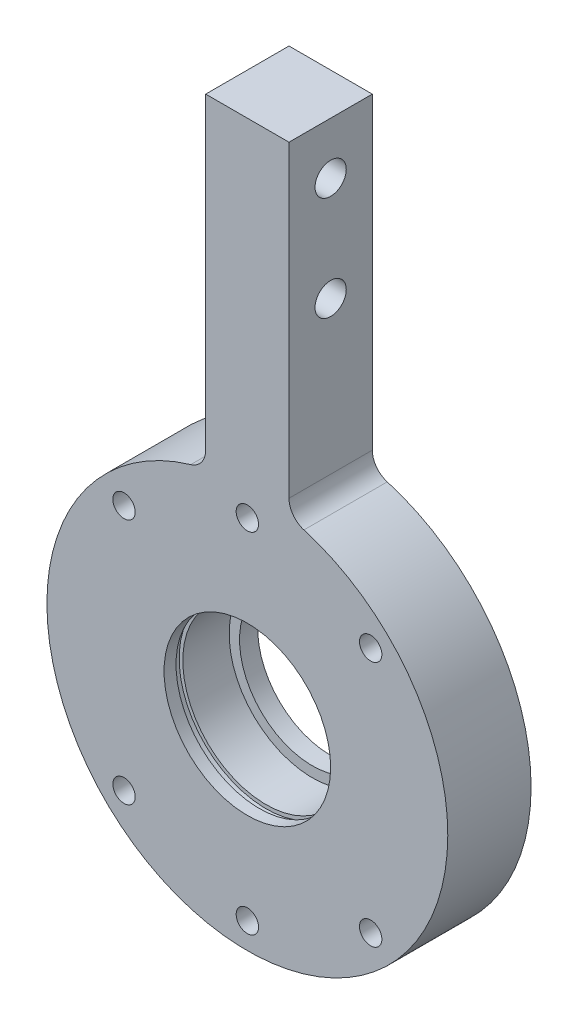
ISO-10303-21;
HEADER;
FILE_DESCRIPTION(('STEP AP214'),'2;1');
FILE_NAME('part.step','',(''),(''),'','','');
FILE_SCHEMA(('AUTOMOTIVE_DESIGN { 1 0 10303 214 1 1 1 1 }'));
ENDSEC;
DATA;
#1=APPLICATION_CONTEXT('core data for automotive mechanical design processes');
#2=APPLICATION_PROTOCOL_DEFINITION('international standard','automotive_design',2000,#1);
#3=PRODUCT_CONTEXT('',#1,'mechanical');
#4=PRODUCT('Part','Part','',(#3));
#5=PRODUCT_RELATED_PRODUCT_CATEGORY('part','',(#4));
#6=PRODUCT_DEFINITION_FORMATION('','',#4);
#7=PRODUCT_DEFINITION_CONTEXT('part definition',#1,'design');
#8=PRODUCT_DEFINITION('design','',#6,#7);
#9=PRODUCT_DEFINITION_SHAPE('','',#8);
#10=(LENGTH_UNIT() NAMED_UNIT(*) SI_UNIT(.MILLI.,.METRE.));
#11=(NAMED_UNIT(*) PLANE_ANGLE_UNIT() SI_UNIT($,.RADIAN.));
#12=(NAMED_UNIT(*) SI_UNIT($,.STERADIAN.) SOLID_ANGLE_UNIT());
#13=UNCERTAINTY_MEASURE_WITH_UNIT(LENGTH_MEASURE(1.E-05),#10,'distance_accuracy_value','');
#14=(GEOMETRIC_REPRESENTATION_CONTEXT(3) GLOBAL_UNCERTAINTY_ASSIGNED_CONTEXT((#13)) GLOBAL_UNIT_ASSIGNED_CONTEXT((#10,
#11,#12)) REPRESENTATION_CONTEXT('',''));
#15=CARTESIAN_POINT('',(0.,0.,0.));
#16=DIRECTION('',(0.,0.,1.));
#17=DIRECTION('',(1.,0.,0.));
#18=AXIS2_PLACEMENT_3D('',#15,#16,#17);
#19=CARTESIAN_POINT('',(0.,0.,-8.));
#20=DIRECTION('',(0.,0.,1.));
#21=DIRECTION('',(1.,0.,0.));
#22=AXIS2_PLACEMENT_3D('',#19,#20,#21);
#23=PLANE('',#22);
#24=CARTESIAN_POINT('',(23.6880771697491,23.6880771697496,-8.));
#25=DIRECTION('',(0.,0.,-1.));
#26=DIRECTION('',(-0.707106781186556,0.707106781186539,0.));
#27=AXIS2_PLACEMENT_3D('',#24,#25,#26);
#28=CIRCLE('',#27,2.15);
#29=CARTESIAN_POINT('',(22.167797590198,25.2083567493007,-8.));
#30=VERTEX_POINT('',#29);
#31=EDGE_CURVE('E262',#30,#30,#28,.T.);
#32=ORIENTED_EDGE('',*,*,#31,.F.);
#33=EDGE_LOOP('',(#32));
#34=FACE_BOUND('',#33,.T.);
#35=CARTESIAN_POINT('',(23.6880771697496,-23.6880771697491,-8.));
#36=DIRECTION('',(0.,0.,-1.));
#37=DIRECTION('',(0.707106781186541,0.707106781186554,0.));
#38=AXIS2_PLACEMENT_3D('',#35,#36,#37);
#39=CIRCLE('',#38,2.15);
#40=CARTESIAN_POINT('',(25.2083567493006,-22.167797590198,-8.));
#41=VERTEX_POINT('',#40);
#42=EDGE_CURVE('E256',#41,#41,#39,.T.);
#43=ORIENTED_EDGE('',*,*,#42,.F.);
#44=EDGE_LOOP('',(#43));
#45=FACE_BOUND('',#44,.T.);
#46=CARTESIAN_POINT('',(0.,-33.5,-8.));
#47=DIRECTION('',(0.,0.,-1.));
#48=DIRECTION('',(1.,0.,0.));
#49=AXIS2_PLACEMENT_3D('',#46,#47,#48);
#50=CIRCLE('',#49,2.15);
#51=CARTESIAN_POINT('',(2.15,-33.5,-8.));
#52=VERTEX_POINT('',#51);
#53=EDGE_CURVE('E250',#52,#52,#50,.T.);
#54=ORIENTED_EDGE('',*,*,#53,.F.);
#55=EDGE_LOOP('',(#54));
#56=FACE_BOUND('',#55,.T.);
#57=CARTESIAN_POINT('',(-23.6880771697492,-23.6880771697495,-8.));
#58=DIRECTION('',(0.,0.,-1.));
#59=DIRECTION('',(0.707106781186551,-0.707106781186544,0.));
#60=AXIS2_PLACEMENT_3D('',#57,#58,#59);
#61=CIRCLE('',#60,2.15);
#62=CARTESIAN_POINT('',(-22.1677975901981,-25.2083567493005,-8.));
#63=VERTEX_POINT('',#62);
#64=EDGE_CURVE('E244',#63,#63,#61,.T.);
#65=ORIENTED_EDGE('',*,*,#64,.F.);
#66=EDGE_LOOP('',(#65));
#67=FACE_BOUND('',#66,.T.);
#68=CARTESIAN_POINT('',(-23.6880771697494,23.6880771697493,-8.));
#69=DIRECTION('',(0.,0.,-1.));
#70=DIRECTION('',(-0.707106781186546,-0.707106781186549,0.));
#71=AXIS2_PLACEMENT_3D('',#68,#69,#70);
#72=CIRCLE('',#71,2.15);
#73=CARTESIAN_POINT('',(-25.2083567493005,22.1677975901982,-8.));
#74=VERTEX_POINT('',#73);
#75=EDGE_CURVE('E238',#74,#74,#72,.T.);
#76=ORIENTED_EDGE('',*,*,#75,.F.);
#77=EDGE_LOOP('',(#76));
#78=FACE_BOUND('',#77,.T.);
#79=CARTESIAN_POINT('',(0.,33.5,-8.));
#80=DIRECTION('',(0.,0.,-1.));
#81=DIRECTION('',(-1.,0.,0.));
#82=AXIS2_PLACEMENT_3D('',#79,#80,#81);
#83=CIRCLE('',#82,2.15);
#84=CARTESIAN_POINT('',(-2.15,33.5,-8.));
#85=VERTEX_POINT('',#84);
#86=EDGE_CURVE('E232',#85,#85,#83,.T.);
#87=ORIENTED_EDGE('',*,*,#86,.F.);
#88=EDGE_LOOP('',(#87));
#89=FACE_BOUND('',#88,.T.);
#90=DIRECTION('',(0.,1.,0.));
#91=VECTOR('',#90,1.);
#92=CARTESIAN_POINT('',(8.,100.,-8.));
#93=LINE('',#92,#91);
#94=CARTESIAN_POINT('',(8.,40.7707002637924,-8.));
#95=VERTEX_POINT('',#94);
#96=CARTESIAN_POINT('',(8.,100.,-8.));
#97=VERTEX_POINT('',#96);
#98=EDGE_CURVE('E105',#95,#97,#93,.T.);
#99=ORIENTED_EDGE('',*,*,#98,.F.);
#100=CARTESIAN_POINT('',(12.,40.7707002637924,-8.));
#101=DIRECTION('',(0.,0.,1.));
#102=DIRECTION('',(1.,0.,0.));
#103=AXIS2_PLACEMENT_3D('',#100,#101,#102);
#104=CIRCLE('',#103,4.);
#105=CARTESIAN_POINT('',(10.8705882352941,36.9334578860237,-8.));
#106=VERTEX_POINT('',#105);
#107=EDGE_CURVE('E61',#95,#106,#104,.T.);
#108=ORIENTED_EDGE('',*,*,#107,.T.);
#109=CARTESIAN_POINT('',(0.,0.,-8.));
#110=DIRECTION('',(0.,0.,1.));
#111=DIRECTION('',(1.,0.,0.));
#112=AXIS2_PLACEMENT_3D('',#109,#110,#111);
#113=CIRCLE('',#112,38.5);
#114=CARTESIAN_POINT('',(-10.8705882352941,36.9334578860237,-8.));
#115=VERTEX_POINT('',#114);
#116=EDGE_CURVE('E127',#115,#106,#113,.T.);
#117=ORIENTED_EDGE('',*,*,#116,.F.);
#118=CARTESIAN_POINT('',(-12.,40.7707002637924,-8.));
#119=DIRECTION('',(0.,0.,1.));
#120=DIRECTION('',(1.,0.,0.));
#121=AXIS2_PLACEMENT_3D('',#118,#119,#120);
#122=CIRCLE('',#121,4.);
#123=CARTESIAN_POINT('',(-8.,40.7707002637924,-8.));
#124=VERTEX_POINT('',#123);
#125=EDGE_CURVE('E141',#115,#124,#122,.T.);
#126=ORIENTED_EDGE('',*,*,#125,.T.);
#127=DIRECTION('',(0.,-1.,0.));
#128=VECTOR('',#127,1.);
#129=CARTESIAN_POINT('',(-8.,100.,-8.));
#130=LINE('',#129,#128);
#131=CARTESIAN_POINT('',(-8.,100.,-8.));
#132=VERTEX_POINT('',#131);
#133=EDGE_CURVE('E118',#132,#124,#130,.T.);
#134=ORIENTED_EDGE('',*,*,#133,.F.);
#135=DIRECTION('',(-1.,0.,0.));
#136=VECTOR('',#135,1.);
#137=CARTESIAN_POINT('',(-8.,100.,-8.));
#138=LINE('',#137,#136);
#139=EDGE_CURVE('E123',#97,#132,#138,.T.);
#140=ORIENTED_EDGE('',*,*,#139,.F.);
#141=EDGE_LOOP('',(#99,#108,#117,#126,#134,#140));
#142=FACE_BOUND('',#141,.T.);
#143=CARTESIAN_POINT('',(0.,0.,-8.));
#144=DIRECTION('',(0.,0.,1.));
#145=DIRECTION('',(1.,0.,0.));
#146=AXIS2_PLACEMENT_3D('',#143,#144,#145);
#147=CIRCLE('',#146,23.);
#148=CARTESIAN_POINT('',(23.,0.,-8.));
#149=VERTEX_POINT('',#148);
#150=EDGE_CURVE('E11',#149,#149,#147,.F.);
#151=ORIENTED_EDGE('',*,*,#150,.F.);
#152=EDGE_LOOP('',(#151));
#153=FACE_BOUND('',#152,.T.);
#154=ADVANCED_FACE('F39',(#34,#45,#56,#67,#78,#89,#142,#153),#23,.F.);
#155=CARTESIAN_POINT('',(0.,0.,0.));
#156=DIRECTION('',(0.,0.,1.));
#157=DIRECTION('',(1.,0.,0.));
#158=AXIS2_PLACEMENT_3D('',#155,#156,#157);
#159=CYLINDRICAL_SURFACE('',#158,16.);
#160=CARTESIAN_POINT('',(0.,0.,-4.5));
#161=DIRECTION('',(0.,0.,1.));
#162=DIRECTION('',(1.,0.,0.));
#163=AXIS2_PLACEMENT_3D('',#160,#161,#162);
#164=CIRCLE('',#163,16.);
#165=CARTESIAN_POINT('',(16.,0.,-4.5));
#166=VERTEX_POINT('',#165);
#167=EDGE_CURVE('E200',#166,#166,#164,.T.);
#168=ORIENTED_EDGE('',*,*,#167,.F.);
#169=EDGE_LOOP('',(#168));
#170=FACE_BOUND('',#169,.T.);
#171=CARTESIAN_POINT('',(0.,0.,4.4));
#172=DIRECTION('',(0.,0.,1.));
#173=DIRECTION('',(1.,0.,0.));
#174=AXIS2_PLACEMENT_3D('',#171,#172,#173);
#175=CIRCLE('',#174,16.);
#176=CARTESIAN_POINT('',(16.,0.,4.4));
#177=VERTEX_POINT('',#176);
#178=EDGE_CURVE('E212',#177,#177,#175,.T.);
#179=ORIENTED_EDGE('',*,*,#178,.T.);
#180=EDGE_LOOP('',(#179));
#181=FACE_BOUND('',#180,.T.);
#182=ADVANCED_FACE('F164',(#170,#181),#159,.F.);
#183=CARTESIAN_POINT('',(0.,0.,8.));
#184=DIRECTION('',(0.,0.,1.));
#185=DIRECTION('',(1.,0.,0.));
#186=AXIS2_PLACEMENT_3D('',#183,#184,#185);
#187=CIRCLE('',#186,16.);
#188=CARTESIAN_POINT('',(16.,0.,8.));
#189=VERTEX_POINT('',#188);
#190=EDGE_CURVE('E203',#189,#189,#187,.T.);
#191=ORIENTED_EDGE('',*,*,#190,.T.);
#192=EDGE_LOOP('',(#191));
#193=FACE_BOUND('',#192,.T.);
#194=CARTESIAN_POINT('',(0.,0.,5.7));
#195=DIRECTION('',(0.,0.,1.));
#196=DIRECTION('',(1.,0.,0.));
#197=AXIS2_PLACEMENT_3D('',#194,#195,#196);
#198=CIRCLE('',#197,16.);
#199=CARTESIAN_POINT('',(16.,0.,5.7));
#200=VERTEX_POINT('',#199);
#201=EDGE_CURVE('E221',#200,#200,#198,.T.);
#202=ORIENTED_EDGE('',*,*,#201,.F.);
#203=EDGE_LOOP('',(#202));
#204=FACE_BOUND('',#203,.T.);
#205=ADVANCED_FACE('F171',(#193,#204),#159,.F.);
#206=CARTESIAN_POINT('',(0.,0.,8.));
#207=DIRECTION('',(0.,0.,1.));
#208=DIRECTION('',(1.,0.,0.));
#209=AXIS2_PLACEMENT_3D('',#206,#207,#208);
#210=PLANE('',#209);
#211=CARTESIAN_POINT('',(23.6880771697491,23.6880771697496,8.));
#212=DIRECTION('',(0.,0.,-1.));
#213=DIRECTION('',(-0.707106781186556,0.707106781186539,0.));
#214=AXIS2_PLACEMENT_3D('',#211,#212,#213);
#215=CIRCLE('',#214,2.15);
#216=CARTESIAN_POINT('',(22.167797590198,25.2083567493007,8.));
#217=VERTEX_POINT('',#216);
#218=EDGE_CURVE('E259',#217,#217,#215,.T.);
#219=ORIENTED_EDGE('',*,*,#218,.T.);
#220=EDGE_LOOP('',(#219));
#221=FACE_BOUND('',#220,.T.);
#222=CARTESIAN_POINT('',(23.6880771697496,-23.6880771697491,8.));
#223=DIRECTION('',(0.,0.,-1.));
#224=DIRECTION('',(0.707106781186541,0.707106781186554,0.));
#225=AXIS2_PLACEMENT_3D('',#222,#223,#224);
#226=CIRCLE('',#225,2.15);
#227=CARTESIAN_POINT('',(25.2083567493006,-22.167797590198,8.));
#228=VERTEX_POINT('',#227);
#229=EDGE_CURVE('E253',#228,#228,#226,.T.);
#230=ORIENTED_EDGE('',*,*,#229,.T.);
#231=EDGE_LOOP('',(#230));
#232=FACE_BOUND('',#231,.T.);
#233=CARTESIAN_POINT('',(0.,-33.5,8.));
#234=DIRECTION('',(0.,0.,-1.));
#235=DIRECTION('',(1.,0.,0.));
#236=AXIS2_PLACEMENT_3D('',#233,#234,#235);
#237=CIRCLE('',#236,2.15);
#238=CARTESIAN_POINT('',(2.15,-33.5,8.));
#239=VERTEX_POINT('',#238);
#240=EDGE_CURVE('E247',#239,#239,#237,.T.);
#241=ORIENTED_EDGE('',*,*,#240,.T.);
#242=EDGE_LOOP('',(#241));
#243=FACE_BOUND('',#242,.T.);
#244=CARTESIAN_POINT('',(-23.6880771697492,-23.6880771697495,8.));
#245=DIRECTION('',(0.,0.,-1.));
#246=DIRECTION('',(0.707106781186551,-0.707106781186544,0.));
#247=AXIS2_PLACEMENT_3D('',#244,#245,#246);
#248=CIRCLE('',#247,2.15);
#249=CARTESIAN_POINT('',(-22.1677975901981,-25.2083567493005,8.));
#250=VERTEX_POINT('',#249);
#251=EDGE_CURVE('E241',#250,#250,#248,.T.);
#252=ORIENTED_EDGE('',*,*,#251,.T.);
#253=EDGE_LOOP('',(#252));
#254=FACE_BOUND('',#253,.T.);
#255=CARTESIAN_POINT('',(-23.6880771697494,23.6880771697493,8.));
#256=DIRECTION('',(0.,0.,-1.));
#257=DIRECTION('',(-0.707106781186546,-0.707106781186549,0.));
#258=AXIS2_PLACEMENT_3D('',#255,#256,#257);
#259=CIRCLE('',#258,2.15);
#260=CARTESIAN_POINT('',(-25.2083567493005,22.1677975901982,8.));
#261=VERTEX_POINT('',#260);
#262=EDGE_CURVE('E235',#261,#261,#259,.T.);
#263=ORIENTED_EDGE('',*,*,#262,.T.);
#264=EDGE_LOOP('',(#263));
#265=FACE_BOUND('',#264,.T.);
#266=CARTESIAN_POINT('',(0.,33.5,8.));
#267=DIRECTION('',(0.,0.,-1.));
#268=DIRECTION('',(-1.,0.,0.));
#269=AXIS2_PLACEMENT_3D('',#266,#267,#268);
#270=CIRCLE('',#269,2.15);
#271=CARTESIAN_POINT('',(-2.15,33.5,8.));
#272=VERTEX_POINT('',#271);
#273=EDGE_CURVE('E229',#272,#272,#270,.T.);
#274=ORIENTED_EDGE('',*,*,#273,.T.);
#275=EDGE_LOOP('',(#274));
#276=FACE_BOUND('',#275,.T.);
#277=DIRECTION('',(0.,-1.,0.));
#278=VECTOR('',#277,1.);
#279=CARTESIAN_POINT('',(-8.,100.,8.));
#280=LINE('',#279,#278);
#281=CARTESIAN_POINT('',(-8.,100.,8.));
#282=VERTEX_POINT('',#281);
#283=CARTESIAN_POINT('',(-8.,40.7707002637924,8.));
#284=VERTEX_POINT('',#283);
#285=EDGE_CURVE('E99',#282,#284,#280,.T.);
#286=ORIENTED_EDGE('',*,*,#285,.T.);
#287=CARTESIAN_POINT('',(-12.,40.7707002637924,8.));
#288=DIRECTION('',(0.,0.,1.));
#289=DIRECTION('',(1.,0.,0.));
#290=AXIS2_PLACEMENT_3D('',#287,#288,#289);
#291=CIRCLE('',#290,4.);
#292=CARTESIAN_POINT('',(-10.8705882352941,36.9334578860237,8.));
#293=VERTEX_POINT('',#292);
#294=EDGE_CURVE('E143',#284,#293,#291,.F.);
#295=ORIENTED_EDGE('',*,*,#294,.T.);
#296=CARTESIAN_POINT('',(0.,0.,8.));
#297=DIRECTION('',(0.,0.,1.));
#298=DIRECTION('',(1.,0.,0.));
#299=AXIS2_PLACEMENT_3D('',#296,#297,#298);
#300=CIRCLE('',#299,38.5);
#301=CARTESIAN_POINT('',(10.8705882352941,36.9334578860237,8.));
#302=VERTEX_POINT('',#301);
#303=EDGE_CURVE('E128',#293,#302,#300,.T.);
#304=ORIENTED_EDGE('',*,*,#303,.T.);
#305=CARTESIAN_POINT('',(12.,40.7707002637924,8.));
#306=DIRECTION('',(0.,0.,1.));
#307=DIRECTION('',(1.,0.,0.));
#308=AXIS2_PLACEMENT_3D('',#305,#306,#307);
#309=CIRCLE('',#308,4.);
#310=CARTESIAN_POINT('',(8.,40.7707002637924,8.));
#311=VERTEX_POINT('',#310);
#312=EDGE_CURVE('E47',#302,#311,#309,.F.);
#313=ORIENTED_EDGE('',*,*,#312,.T.);
#314=DIRECTION('',(0.,1.,0.));
#315=VECTOR('',#314,1.);
#316=CARTESIAN_POINT('',(8.,100.,8.));
#317=LINE('',#316,#315);
#318=CARTESIAN_POINT('',(8.,100.,8.));
#319=VERTEX_POINT('',#318);
#320=EDGE_CURVE('E90',#311,#319,#317,.T.);
#321=ORIENTED_EDGE('',*,*,#320,.T.);
#322=DIRECTION('',(-1.,0.,0.));
#323=VECTOR('',#322,1.);
#324=CARTESIAN_POINT('',(-8.,100.,8.));
#325=LINE('',#324,#323);
#326=EDGE_CURVE('E96',#319,#282,#325,.T.);
#327=ORIENTED_EDGE('',*,*,#326,.T.);
#328=EDGE_LOOP('',(#286,#295,#304,#313,#321,#327));
#329=FACE_BOUND('',#328,.T.);
#330=ORIENTED_EDGE('',*,*,#190,.F.);
#331=EDGE_LOOP('',(#330));
#332=FACE_BOUND('',#331,.T.);
#333=ADVANCED_FACE('F93',(#221,#232,#243,#254,#265,#276,#329,#332),#210,.T.);
#334=CARTESIAN_POINT('',(0.,0.,8.));
#335=DIRECTION('',(0.,0.,-1.));
#336=DIRECTION('',(-1.,0.,0.));
#337=AXIS2_PLACEMENT_3D('',#334,#335,#336);
#338=CYLINDRICAL_SURFACE('',#337,14.);
#339=CARTESIAN_POINT('',(0.,0.,-8.));
#340=DIRECTION('',(0.,0.,1.));
#341=DIRECTION('',(1.,0.,0.));
#342=AXIS2_PLACEMENT_3D('',#339,#340,#341);
#343=CIRCLE('',#342,14.);
#344=CARTESIAN_POINT('',(14.,0.,-8.));
#345=VERTEX_POINT('',#344);
#346=EDGE_CURVE('E108',#345,#345,#343,.T.);
#347=ORIENTED_EDGE('',*,*,#346,.F.);
#348=EDGE_LOOP('',(#347));
#349=FACE_BOUND('',#348,.T.);
#350=CARTESIAN_POINT('',(0.,0.,-4.5));
#351=DIRECTION('',(0.,0.,1.));
#352=DIRECTION('',(1.,0.,0.));
#353=AXIS2_PLACEMENT_3D('',#350,#351,#352);
#354=CIRCLE('',#353,14.);
#355=CARTESIAN_POINT('',(14.,0.,-4.5));
#356=VERTEX_POINT('',#355);
#357=EDGE_CURVE('E121',#356,#356,#354,.T.);
#358=ORIENTED_EDGE('',*,*,#357,.T.);
#359=EDGE_LOOP('',(#358));
#360=FACE_BOUND('',#359,.T.);
#361=ADVANCED_FACE('F187',(#349,#360),#338,.F.);
#362=CARTESIAN_POINT('',(0.,0.,8.));
#363=DIRECTION('',(0.,0.,-1.));
#364=DIRECTION('',(-1.,0.,0.));
#365=AXIS2_PLACEMENT_3D('',#362,#363,#364);
#366=CYLINDRICAL_SURFACE('',#365,38.5);
#367=ORIENTED_EDGE('',*,*,#303,.F.);
#368=DIRECTION('',(0.,0.,-1.));
#369=VECTOR('',#368,1.);
#370=CARTESIAN_POINT('',(-10.8705882352941,36.9334578860237,8.));
#371=LINE('',#370,#369);
#372=EDGE_CURVE('E134',#293,#115,#371,.T.);
#373=ORIENTED_EDGE('',*,*,#372,.T.);
#374=ORIENTED_EDGE('',*,*,#116,.T.);
#375=DIRECTION('',(0.,0.,-1.));
#376=VECTOR('',#375,1.);
#377=CARTESIAN_POINT('',(10.8705882352941,36.9334578860237,8.));
#378=LINE('',#377,#376);
#379=EDGE_CURVE('E130',#106,#302,#378,.F.);
#380=ORIENTED_EDGE('',*,*,#379,.T.);
#381=EDGE_LOOP('',(#367,#373,#374,#380));
#382=FACE_BOUND('',#381,.T.);
#383=ADVANCED_FACE('F150',(#382),#366,.T.);
#384=CARTESIAN_POINT('',(0.,0.,-8.));
#385=DIRECTION('',(0.,0.,-1.));
#386=DIRECTION('',(-1.,0.,0.));
#387=AXIS2_PLACEMENT_3D('',#384,#385,#386);
#388=CIRCLE('',#387,21.);
#389=CARTESIAN_POINT('',(-21.,0.,-8.));
#390=VERTEX_POINT('',#389);
#391=EDGE_CURVE('E191',#390,#390,#388,.T.);
#392=ORIENTED_EDGE('',*,*,#391,.T.);
#393=EDGE_LOOP('',(#392));
#394=FACE_BOUND('',#393,.T.);
#395=ORIENTED_EDGE('',*,*,#346,.T.);
#396=EDGE_LOOP('',(#395));
#397=FACE_BOUND('',#396,.T.);
#398=ADVANCED_FACE('F167',(#394,#397),#23,.F.);
#399=CARTESIAN_POINT('',(-8.,100.,8.));
#400=DIRECTION('',(1.,0.,0.));
#401=DIRECTION('',(0.,1.,0.));
#402=AXIS2_PLACEMENT_3D('',#399,#400,#401);
#403=PLANE('',#402);
#404=CARTESIAN_POINT('',(-8.,70.,0.));
#405=DIRECTION('',(1.,0.,0.));
#406=DIRECTION('',(0.,1.,0.));
#407=AXIS2_PLACEMENT_3D('',#404,#405,#406);
#408=CIRCLE('',#407,3.);
#409=CARTESIAN_POINT('',(-8.,73.,0.));
#410=VERTEX_POINT('',#409);
#411=EDGE_CURVE('E273',#410,#410,#408,.T.);
#412=ORIENTED_EDGE('',*,*,#411,.T.);
#413=EDGE_LOOP('',(#412));
#414=FACE_BOUND('',#413,.T.);
#415=CARTESIAN_POINT('',(-8.,90.,0.));
#416=DIRECTION('',(1.,0.,0.));
#417=DIRECTION('',(0.,1.,0.));
#418=AXIS2_PLACEMENT_3D('',#415,#416,#417);
#419=CIRCLE('',#418,3.);
#420=CARTESIAN_POINT('',(-8.,93.,0.));
#421=VERTEX_POINT('',#420);
#422=EDGE_CURVE('E265',#421,#421,#419,.T.);
#423=ORIENTED_EDGE('',*,*,#422,.T.);
#424=EDGE_LOOP('',(#423));
#425=FACE_BOUND('',#424,.T.);
#426=ORIENTED_EDGE('',*,*,#133,.T.);
#427=DIRECTION('',(0.,0.,1.));
#428=VECTOR('',#427,1.);
#429=CARTESIAN_POINT('',(-8.,40.7707002637924,8.));
#430=LINE('',#429,#428);
#431=EDGE_CURVE('E137',#124,#284,#430,.T.);
#432=ORIENTED_EDGE('',*,*,#431,.T.);
#433=ORIENTED_EDGE('',*,*,#285,.F.);
#434=DIRECTION('',(0.,0.,-1.));
#435=VECTOR('',#434,1.);
#436=CARTESIAN_POINT('',(-8.,100.,8.));
#437=LINE('',#436,#435);
#438=EDGE_CURVE('E109',#282,#132,#437,.T.);
#439=ORIENTED_EDGE('',*,*,#438,.T.);
#440=EDGE_LOOP('',(#426,#432,#433,#439));
#441=FACE_BOUND('',#440,.T.);
#442=ADVANCED_FACE('F179',(#414,#425,#441),#403,.F.);
#443=CARTESIAN_POINT('',(8.,100.,8.));
#444=DIRECTION('',(-1.,0.,0.));
#445=DIRECTION('',(0.,-1.,0.));
#446=AXIS2_PLACEMENT_3D('',#443,#444,#445);
#447=PLANE('',#446);
#448=CARTESIAN_POINT('',(8.,70.,0.));
#449=DIRECTION('',(1.,0.,0.));
#450=DIRECTION('',(0.,1.,0.));
#451=AXIS2_PLACEMENT_3D('',#448,#449,#450);
#452=CIRCLE('',#451,3.);
#453=CARTESIAN_POINT('',(7.99999999999999,73.,0.));
#454=VERTEX_POINT('',#453);
#455=EDGE_CURVE('E276',#454,#454,#452,.T.);
#456=ORIENTED_EDGE('',*,*,#455,.F.);
#457=EDGE_LOOP('',(#456));
#458=FACE_BOUND('',#457,.T.);
#459=CARTESIAN_POINT('',(8.,90.,0.));
#460=DIRECTION('',(1.,0.,0.));
#461=DIRECTION('',(0.,1.,0.));
#462=AXIS2_PLACEMENT_3D('',#459,#460,#461);
#463=CIRCLE('',#462,3.);
#464=CARTESIAN_POINT('',(8.00000000000001,93.,0.));
#465=VERTEX_POINT('',#464);
#466=EDGE_CURVE('E270',#465,#465,#463,.T.);
#467=ORIENTED_EDGE('',*,*,#466,.F.);
#468=EDGE_LOOP('',(#467));
#469=FACE_BOUND('',#468,.T.);
#470=ORIENTED_EDGE('',*,*,#320,.F.);
#471=DIRECTION('',(0.,0.,1.));
#472=VECTOR('',#471,1.);
#473=CARTESIAN_POINT('',(8.,40.7707002637924,-8.));
#474=LINE('',#473,#472);
#475=EDGE_CURVE('E139',#311,#95,#474,.F.);
#476=ORIENTED_EDGE('',*,*,#475,.T.);
#477=ORIENTED_EDGE('',*,*,#98,.T.);
#478=DIRECTION('',(0.,0.,-1.));
#479=VECTOR('',#478,1.);
#480=CARTESIAN_POINT('',(8.,100.,8.));
#481=LINE('',#480,#479);
#482=EDGE_CURVE('E102',#319,#97,#481,.T.);
#483=ORIENTED_EDGE('',*,*,#482,.F.);
#484=EDGE_LOOP('',(#470,#476,#477,#483));
#485=FACE_BOUND('',#484,.T.);
#486=ADVANCED_FACE('F103',(#458,#469,#485),#447,.F.);
#487=CARTESIAN_POINT('',(-8.,100.,8.));
#488=DIRECTION('',(0.,-1.,0.));
#489=DIRECTION('',(0.,0.,-1.));
#490=AXIS2_PLACEMENT_3D('',#487,#488,#489);
#491=PLANE('',#490);
#492=ORIENTED_EDGE('',*,*,#139,.T.);
#493=ORIENTED_EDGE('',*,*,#438,.F.);
#494=ORIENTED_EDGE('',*,*,#326,.F.);
#495=ORIENTED_EDGE('',*,*,#482,.T.);
#496=EDGE_LOOP('',(#492,#493,#494,#495));
#497=FACE_BOUND('',#496,.T.);
#498=ADVANCED_FACE('F111',(#497),#491,.F.);
#499=CARTESIAN_POINT('',(-12.,40.7707002637924,8.));
#500=DIRECTION('',(0.,0.,-1.));
#501=DIRECTION('',(-1.,0.,0.));
#502=AXIS2_PLACEMENT_3D('',#499,#500,#501);
#503=CYLINDRICAL_SURFACE('',#502,4.);
#504=ORIENTED_EDGE('',*,*,#294,.F.);
#505=ORIENTED_EDGE('',*,*,#431,.F.);
#506=ORIENTED_EDGE('',*,*,#125,.F.);
#507=ORIENTED_EDGE('',*,*,#372,.F.);
#508=EDGE_LOOP('',(#504,#505,#506,#507));
#509=FACE_BOUND('',#508,.T.);
#510=ADVANCED_FACE('F154',(#509),#503,.F.);
#511=CARTESIAN_POINT('',(12.,40.7707002637924,8.));
#512=DIRECTION('',(0.,0.,-1.));
#513=DIRECTION('',(-1.,0.,0.));
#514=AXIS2_PLACEMENT_3D('',#511,#512,#513);
#515=CYLINDRICAL_SURFACE('',#514,4.);
#516=ORIENTED_EDGE('',*,*,#312,.F.);
#517=ORIENTED_EDGE('',*,*,#379,.F.);
#518=ORIENTED_EDGE('',*,*,#107,.F.);
#519=ORIENTED_EDGE('',*,*,#475,.F.);
#520=EDGE_LOOP('',(#516,#517,#518,#519));
#521=FACE_BOUND('',#520,.T.);
#522=ADVANCED_FACE('F41',(#521),#515,.F.);
#523=CARTESIAN_POINT('',(0.,14.,-4.5));
#524=DIRECTION('',(0.,0.,1.));
#525=DIRECTION('',(1.,0.,0.));
#526=AXIS2_PLACEMENT_3D('',#523,#524,#525);
#527=PLANE('',#526);
#528=ORIENTED_EDGE('',*,*,#167,.T.);
#529=EDGE_LOOP('',(#528));
#530=FACE_BOUND('',#529,.T.);
#531=ORIENTED_EDGE('',*,*,#357,.F.);
#532=EDGE_LOOP('',(#531));
#533=FACE_BOUND('',#532,.T.);
#534=ADVANCED_FACE('F153',(#530,#533),#527,.T.);
#535=CARTESIAN_POINT('',(0.,16.,4.4));
#536=DIRECTION('',(0.,0.,1.));
#537=DIRECTION('',(1.,0.,0.));
#538=AXIS2_PLACEMENT_3D('',#535,#536,#537);
#539=PLANE('',#538);
#540=CARTESIAN_POINT('',(0.,0.,4.4));
#541=DIRECTION('',(0.,0.,1.));
#542=DIRECTION('',(1.,0.,0.));
#543=AXIS2_PLACEMENT_3D('',#540,#541,#542);
#544=CIRCLE('',#543,16.7);
#545=CARTESIAN_POINT('',(16.7,0.,4.4));
#546=VERTEX_POINT('',#545);
#547=EDGE_CURVE('E215',#546,#546,#544,.T.);
#548=ORIENTED_EDGE('',*,*,#547,.T.);
#549=EDGE_LOOP('',(#548));
#550=FACE_BOUND('',#549,.T.);
#551=ORIENTED_EDGE('',*,*,#178,.F.);
#552=EDGE_LOOP('',(#551));
#553=FACE_BOUND('',#552,.T.);
#554=ADVANCED_FACE('F159',(#550,#553),#539,.T.);
#555=CARTESIAN_POINT('',(0.,0.,0.));
#556=DIRECTION('',(0.,0.,1.));
#557=DIRECTION('',(1.,0.,0.));
#558=AXIS2_PLACEMENT_3D('',#555,#556,#557);
#559=CYLINDRICAL_SURFACE('',#558,16.7);
#560=CARTESIAN_POINT('',(0.,0.,5.7));
#561=DIRECTION('',(0.,0.,1.));
#562=DIRECTION('',(1.,0.,0.));
#563=AXIS2_PLACEMENT_3D('',#560,#561,#562);
#564=CIRCLE('',#563,16.7);
#565=CARTESIAN_POINT('',(16.7,0.,5.7));
#566=VERTEX_POINT('',#565);
#567=EDGE_CURVE('E218',#566,#566,#564,.T.);
#568=ORIENTED_EDGE('',*,*,#567,.T.);
#569=EDGE_LOOP('',(#568));
#570=FACE_BOUND('',#569,.T.);
#571=ORIENTED_EDGE('',*,*,#547,.F.);
#572=EDGE_LOOP('',(#571));
#573=FACE_BOUND('',#572,.T.);
#574=ADVANCED_FACE('F338',(#570,#573),#559,.F.);
#575=CARTESIAN_POINT('',(0.,16.7,5.7));
#576=DIRECTION('',(0.,0.,-1.));
#577=DIRECTION('',(-1.,0.,0.));
#578=AXIS2_PLACEMENT_3D('',#575,#576,#577);
#579=PLANE('',#578);
#580=ORIENTED_EDGE('',*,*,#201,.T.);
#581=EDGE_LOOP('',(#580));
#582=FACE_BOUND('',#581,.T.);
#583=ORIENTED_EDGE('',*,*,#567,.F.);
#584=EDGE_LOOP('',(#583));
#585=FACE_BOUND('',#584,.T.);
#586=ADVANCED_FACE('F331',(#582,#585),#579,.T.);
#587=CARTESIAN_POINT('',(0.,0.,-10.));
#588=DIRECTION('',(0.,0.,-1.));
#589=DIRECTION('',(-1.,0.,0.));
#590=AXIS2_PLACEMENT_3D('',#587,#588,#589);
#591=PLANE('',#590);
#592=CARTESIAN_POINT('',(0.,0.,-10.));
#593=DIRECTION('',(0.,0.,-1.));
#594=DIRECTION('',(-1.,0.,0.));
#595=AXIS2_PLACEMENT_3D('',#592,#593,#594);
#596=CIRCLE('',#595,23.);
#597=CARTESIAN_POINT('',(-23.,0.,-10.));
#598=VERTEX_POINT('',#597);
#599=EDGE_CURVE('E224',#598,#598,#596,.T.);
#600=ORIENTED_EDGE('',*,*,#599,.T.);
#601=EDGE_LOOP('',(#600));
#602=FACE_BOUND('',#601,.T.);
#603=CARTESIAN_POINT('',(0.,0.,-10.));
#604=DIRECTION('',(0.,0.,-1.));
#605=DIRECTION('',(-1.,0.,0.));
#606=AXIS2_PLACEMENT_3D('',#603,#604,#605);
#607=CIRCLE('',#606,21.);
#608=CARTESIAN_POINT('',(-21.,0.,-10.));
#609=VERTEX_POINT('',#608);
#610=EDGE_CURVE('E227',#609,#609,#607,.T.);
#611=ORIENTED_EDGE('',*,*,#610,.F.);
#612=EDGE_LOOP('',(#611));
#613=FACE_BOUND('',#612,.T.);
#614=ADVANCED_FACE('F328',(#602,#613),#591,.T.);
#615=CARTESIAN_POINT('',(0.,0.,-10.));
#616=DIRECTION('',(0.,0.,1.));
#617=DIRECTION('',(1.,0.,0.));
#618=AXIS2_PLACEMENT_3D('',#615,#616,#617);
#619=CYLINDRICAL_SURFACE('',#618,23.);
#620=ORIENTED_EDGE('',*,*,#599,.F.);
#621=EDGE_LOOP('',(#620));
#622=FACE_BOUND('',#621,.T.);
#623=ORIENTED_EDGE('',*,*,#150,.T.);
#624=EDGE_LOOP('',(#623));
#625=FACE_BOUND('',#624,.T.);
#626=ADVANCED_FACE('F326',(#622,#625),#619,.T.);
#627=CARTESIAN_POINT('',(0.,0.,-10.));
#628=DIRECTION('',(0.,0.,1.));
#629=DIRECTION('',(1.,0.,0.));
#630=AXIS2_PLACEMENT_3D('',#627,#628,#629);
#631=CYLINDRICAL_SURFACE('',#630,21.);
#632=ORIENTED_EDGE('',*,*,#610,.T.);
#633=EDGE_LOOP('',(#632));
#634=FACE_BOUND('',#633,.T.);
#635=ORIENTED_EDGE('',*,*,#391,.F.);
#636=EDGE_LOOP('',(#635));
#637=FACE_BOUND('',#636,.T.);
#638=ADVANCED_FACE('F322',(#634,#637),#631,.F.);
#639=CARTESIAN_POINT('',(0.,33.5,8.));
#640=DIRECTION('',(0.,0.,-1.));
#641=DIRECTION('',(-1.,0.,0.));
#642=AXIS2_PLACEMENT_3D('',#639,#640,#641);
#643=CYLINDRICAL_SURFACE('',#642,2.15);
#644=ORIENTED_EDGE('',*,*,#273,.F.);
#645=EDGE_LOOP('',(#644));
#646=FACE_BOUND('',#645,.T.);
#647=ORIENTED_EDGE('',*,*,#86,.T.);
#648=EDGE_LOOP('',(#647));
#649=FACE_BOUND('',#648,.T.);
#650=ADVANCED_FACE('F318',(#646,#649),#643,.F.);
#651=CARTESIAN_POINT('',(-23.6880771697494,23.6880771697493,8.));
#652=DIRECTION('',(0.,0.,-1.));
#653=DIRECTION('',(-1.,0.,0.));
#654=AXIS2_PLACEMENT_3D('',#651,#652,#653);
#655=CYLINDRICAL_SURFACE('',#654,2.15);
#656=ORIENTED_EDGE('',*,*,#262,.F.);
#657=EDGE_LOOP('',(#656));
#658=FACE_BOUND('',#657,.T.);
#659=ORIENTED_EDGE('',*,*,#75,.T.);
#660=EDGE_LOOP('',(#659));
#661=FACE_BOUND('',#660,.T.);
#662=ADVANCED_FACE('F314',(#658,#661),#655,.F.);
#663=CARTESIAN_POINT('',(-23.6880771697492,-23.6880771697495,8.));
#664=DIRECTION('',(0.,0.,-1.));
#665=DIRECTION('',(-1.,0.,0.));
#666=AXIS2_PLACEMENT_3D('',#663,#664,#665);
#667=CYLINDRICAL_SURFACE('',#666,2.15);
#668=ORIENTED_EDGE('',*,*,#251,.F.);
#669=EDGE_LOOP('',(#668));
#670=FACE_BOUND('',#669,.T.);
#671=ORIENTED_EDGE('',*,*,#64,.T.);
#672=EDGE_LOOP('',(#671));
#673=FACE_BOUND('',#672,.T.);
#674=ADVANCED_FACE('F310',(#670,#673),#667,.F.);
#675=CARTESIAN_POINT('',(0.,-33.5,8.));
#676=DIRECTION('',(0.,0.,-1.));
#677=DIRECTION('',(-1.,0.,0.));
#678=AXIS2_PLACEMENT_3D('',#675,#676,#677);
#679=CYLINDRICAL_SURFACE('',#678,2.15);
#680=ORIENTED_EDGE('',*,*,#240,.F.);
#681=EDGE_LOOP('',(#680));
#682=FACE_BOUND('',#681,.T.);
#683=ORIENTED_EDGE('',*,*,#53,.T.);
#684=EDGE_LOOP('',(#683));
#685=FACE_BOUND('',#684,.T.);
#686=ADVANCED_FACE('F306',(#682,#685),#679,.F.);
#687=CARTESIAN_POINT('',(23.6880771697496,-23.6880771697491,8.));
#688=DIRECTION('',(0.,0.,-1.));
#689=DIRECTION('',(-1.,0.,0.));
#690=AXIS2_PLACEMENT_3D('',#687,#688,#689);
#691=CYLINDRICAL_SURFACE('',#690,2.15);
#692=ORIENTED_EDGE('',*,*,#229,.F.);
#693=EDGE_LOOP('',(#692));
#694=FACE_BOUND('',#693,.T.);
#695=ORIENTED_EDGE('',*,*,#42,.T.);
#696=EDGE_LOOP('',(#695));
#697=FACE_BOUND('',#696,.T.);
#698=ADVANCED_FACE('F300',(#694,#697),#691,.F.);
#699=CARTESIAN_POINT('',(23.6880771697491,23.6880771697496,8.));
#700=DIRECTION('',(0.,0.,-1.));
#701=DIRECTION('',(-1.,0.,0.));
#702=AXIS2_PLACEMENT_3D('',#699,#700,#701);
#703=CYLINDRICAL_SURFACE('',#702,2.15);
#704=ORIENTED_EDGE('',*,*,#218,.F.);
#705=EDGE_LOOP('',(#704));
#706=FACE_BOUND('',#705,.T.);
#707=ORIENTED_EDGE('',*,*,#31,.T.);
#708=EDGE_LOOP('',(#707));
#709=FACE_BOUND('',#708,.T.);
#710=ADVANCED_FACE('F291',(#706,#709),#703,.F.);
#711=CARTESIAN_POINT('',(-38.5,90.,0.));
#712=DIRECTION('',(1.,0.,0.));
#713=DIRECTION('',(0.,1.,0.));
#714=AXIS2_PLACEMENT_3D('',#711,#712,#713);
#715=CYLINDRICAL_SURFACE('',#714,3.);
#716=CARTESIAN_POINT('',(8.00000000000001,93.,0.));
#717=CARTESIAN_POINT('',(7.83333333333334,93.,0.));
#718=CARTESIAN_POINT('',(7.66666666666667,93.,0.));
#719=CARTESIAN_POINT('',(7.33333333333334,93.,0.));
#720=CARTESIAN_POINT('',(7.16666666666667,93.,0.));
#721=CARTESIAN_POINT('',(6.83333333333334,93.,0.));
#722=CARTESIAN_POINT('',(6.66666666666667,93.,0.));
#723=CARTESIAN_POINT('',(6.33333333333334,93.,0.));
#724=CARTESIAN_POINT('',(6.16666666666667,93.,0.));
#725=CARTESIAN_POINT('',(5.83333333333334,93.,0.));
#726=CARTESIAN_POINT('',(5.66666666666667,93.,0.));
#727=CARTESIAN_POINT('',(5.33333333333334,93.,0.));
#728=CARTESIAN_POINT('',(5.16666666666667,93.,0.));
#729=CARTESIAN_POINT('',(4.83333333333334,93.,0.));
#730=CARTESIAN_POINT('',(4.66666666666667,93.,0.));
#731=CARTESIAN_POINT('',(4.33333333333334,93.,0.));
#732=CARTESIAN_POINT('',(4.16666666666667,93.,0.));
#733=CARTESIAN_POINT('',(3.83333333333334,93.,0.));
#734=CARTESIAN_POINT('',(3.66666666666667,93.,0.));
#735=CARTESIAN_POINT('',(3.33333333333334,93.,0.));
#736=CARTESIAN_POINT('',(3.16666666666667,93.,0.));
#737=CARTESIAN_POINT('',(2.83333333333334,93.,0.));
#738=CARTESIAN_POINT('',(2.66666666666667,93.,0.));
#739=CARTESIAN_POINT('',(2.33333333333334,93.,0.));
#740=CARTESIAN_POINT('',(2.16666666666667,93.,0.));
#741=CARTESIAN_POINT('',(1.83333333333334,93.,0.));
#742=CARTESIAN_POINT('',(1.66666666666667,93.,0.));
#743=CARTESIAN_POINT('',(1.33333333333333,93.,0.));
#744=CARTESIAN_POINT('',(1.16666666666667,93.,0.));
#745=CARTESIAN_POINT('',(0.833333333333334,93.,0.));
#746=CARTESIAN_POINT('',(0.666666666666667,93.,0.));
#747=CARTESIAN_POINT('',(0.333333333333334,93.,0.));
#748=CARTESIAN_POINT('',(0.166666666666667,93.,0.));
#749=CARTESIAN_POINT('',(-0.166666666666667,93.,0.));
#750=CARTESIAN_POINT('',(-0.333333333333334,93.,0.));
#751=CARTESIAN_POINT('',(-0.666666666666667,93.,0.));
#752=CARTESIAN_POINT('',(-0.833333333333334,93.,0.));
#753=CARTESIAN_POINT('',(-1.16666666666667,93.,0.));
#754=CARTESIAN_POINT('',(-1.33333333333333,93.,0.));
#755=CARTESIAN_POINT('',(-1.66666666666667,93.,0.));
#756=CARTESIAN_POINT('',(-1.83333333333334,93.,0.));
#757=CARTESIAN_POINT('',(-2.16666666666667,93.,0.));
#758=CARTESIAN_POINT('',(-2.33333333333334,93.,0.));
#759=CARTESIAN_POINT('',(-2.66666666666667,93.,0.));
#760=CARTESIAN_POINT('',(-2.83333333333334,93.,0.));
#761=CARTESIAN_POINT('',(-3.16666666666667,93.,0.));
#762=CARTESIAN_POINT('',(-3.33333333333334,93.,0.));
#763=CARTESIAN_POINT('',(-3.66666666666667,93.,0.));
#764=CARTESIAN_POINT('',(-3.83333333333334,93.,0.));
#765=CARTESIAN_POINT('',(-4.16666666666667,93.,0.));
#766=CARTESIAN_POINT('',(-4.33333333333334,93.,0.));
#767=CARTESIAN_POINT('',(-4.66666666666667,93.,0.));
#768=CARTESIAN_POINT('',(-4.83333333333334,93.,0.));
#769=CARTESIAN_POINT('',(-5.16666666666667,93.,0.));
#770=CARTESIAN_POINT('',(-5.33333333333334,93.,0.));
#771=CARTESIAN_POINT('',(-5.66666666666667,93.,0.));
#772=CARTESIAN_POINT('',(-5.83333333333334,93.,0.));
#773=CARTESIAN_POINT('',(-6.16666666666667,93.,0.));
#774=CARTESIAN_POINT('',(-6.33333333333334,93.,0.));
#775=CARTESIAN_POINT('',(-6.66666666666667,93.,0.));
#776=CARTESIAN_POINT('',(-6.83333333333334,93.,0.));
#777=CARTESIAN_POINT('',(-7.16666666666667,93.,0.));
#778=CARTESIAN_POINT('',(-7.33333333333334,93.,0.));
#779=CARTESIAN_POINT('',(-7.66666666666667,93.,0.));
#780=CARTESIAN_POINT('',(-7.83333333333334,93.,0.));
#781=CARTESIAN_POINT('',(-8.,93.,0.));
#782=B_SPLINE_CURVE_WITH_KNOTS('',3,(#716,#717,#718,#719,#720,#721,#722,#723,#724,#725,#726,
#727,#728,#729,#730,#731,#732,#733,#734,#735,#736,#737,#738,#739,#740,#741,#742,#743,#744,#745,
#746,#747,#748,#749,#750,#751,#752,#753,#754,#755,#756,#757,#758,#759,#760,#761,#762,#763,#764,
#765,#766,#767,#768,#769,#770,#771,#772,#773,#774,#775,#776,#777,#778,#779,#780,#781),
.UNSPECIFIED.,.F.,.F.,(4,2,2,2,2,2,2,2,2,2,2,2,2,2,2,2,2,2,2,2,2,2,2,2,2,2,2,2,2,2,2,2,4),(0.,
0.5,1.,1.5,2.,2.5,3.,3.5,4.,4.5,5.,5.50000000000001,6.00000000000001,6.50000000000001,
7.00000000000001,7.50000000000001,8.00000000000001,8.50000000000001,9.00000000000001,
9.50000000000001,10.,10.5,11.,11.5,12.,12.5,13.,13.5,14.,14.5,15.,15.5,16.),.UNSPECIFIED.);
#783=EDGE_CURVE('BSEAM288',#465,#421,#782,.T.);
#784=ORIENTED_EDGE('',*,*,#466,.T.);
#785=ORIENTED_EDGE('',*,*,#422,.F.);
#786=ORIENTED_EDGE('',*,*,#783,.T.);
#787=ORIENTED_EDGE('',*,*,#783,.F.);
#788=EDGE_LOOP('',(#784,#786,#785,#787));
#789=FACE_BOUND('',#788,.T.);
#790=ADVANCED_FACE('F288',(#789),#715,.F.);
#791=CARTESIAN_POINT('',(-38.5,70.,0.));
#792=DIRECTION('',(1.,0.,0.));
#793=DIRECTION('',(0.,1.,0.));
#794=AXIS2_PLACEMENT_3D('',#791,#792,#793);
#795=CYLINDRICAL_SURFACE('',#794,3.);
#796=CARTESIAN_POINT('',(7.99999999999999,73.,0.));
#797=CARTESIAN_POINT('',(7.83333333333333,73.,0.));
#798=CARTESIAN_POINT('',(7.66666666666666,73.,0.));
#799=CARTESIAN_POINT('',(7.33333333333333,73.,0.));
#800=CARTESIAN_POINT('',(7.16666666666666,73.,0.));
#801=CARTESIAN_POINT('',(6.83333333333333,73.,0.));
#802=CARTESIAN_POINT('',(6.66666666666666,73.,0.));
#803=CARTESIAN_POINT('',(6.33333333333333,73.,0.));
#804=CARTESIAN_POINT('',(6.16666666666666,73.,0.));
#805=CARTESIAN_POINT('',(5.83333333333333,73.,0.));
#806=CARTESIAN_POINT('',(5.66666666666666,73.,0.));
#807=CARTESIAN_POINT('',(5.33333333333332,73.,0.));
#808=CARTESIAN_POINT('',(5.16666666666666,73.,0.));
#809=CARTESIAN_POINT('',(4.83333333333332,73.,0.));
#810=CARTESIAN_POINT('',(4.66666666666666,73.,0.));
#811=CARTESIAN_POINT('',(4.33333333333332,73.,0.));
#812=CARTESIAN_POINT('',(4.16666666666666,73.,0.));
#813=CARTESIAN_POINT('',(3.83333333333332,73.,0.));
#814=CARTESIAN_POINT('',(3.66666666666666,73.,0.));
#815=CARTESIAN_POINT('',(3.33333333333333,73.,0.));
#816=CARTESIAN_POINT('',(3.16666666666666,73.,0.));
#817=CARTESIAN_POINT('',(2.83333333333333,73.,0.));
#818=CARTESIAN_POINT('',(2.66666666666666,73.,0.));
#819=CARTESIAN_POINT('',(2.33333333333333,73.,0.));
#820=CARTESIAN_POINT('',(2.16666666666666,73.,0.));
#821=CARTESIAN_POINT('',(1.83333333333333,73.,0.));
#822=CARTESIAN_POINT('',(1.66666666666666,73.,0.));
#823=CARTESIAN_POINT('',(1.33333333333333,73.,0.));
#824=CARTESIAN_POINT('',(1.16666666666666,73.,0.));
#825=CARTESIAN_POINT('',(0.833333333333327,73.,0.));
#826=CARTESIAN_POINT('',(0.66666666666666,73.,0.));
#827=CARTESIAN_POINT('',(0.333333333333327,73.,0.));
#828=CARTESIAN_POINT('',(0.16666666666666,73.,0.));
#829=CARTESIAN_POINT('',(-0.166666666666674,73.,0.));
#830=CARTESIAN_POINT('',(-0.333333333333341,73.,0.));
#831=CARTESIAN_POINT('',(-0.666666666666674,73.,0.));
#832=CARTESIAN_POINT('',(-0.833333333333341,73.,0.));
#833=CARTESIAN_POINT('',(-1.16666666666667,73.,0.));
#834=CARTESIAN_POINT('',(-1.33333333333334,73.,0.));
#835=CARTESIAN_POINT('',(-1.66666666666667,73.,0.));
#836=CARTESIAN_POINT('',(-1.83333333333334,73.,0.));
#837=CARTESIAN_POINT('',(-2.16666666666668,73.,0.));
#838=CARTESIAN_POINT('',(-2.33333333333334,73.,0.));
#839=CARTESIAN_POINT('',(-2.66666666666667,73.,0.));
#840=CARTESIAN_POINT('',(-2.83333333333334,73.,0.));
#841=CARTESIAN_POINT('',(-3.16666666666667,73.,0.));
#842=CARTESIAN_POINT('',(-3.33333333333334,73.,0.));
#843=CARTESIAN_POINT('',(-3.66666666666667,73.,0.));
#844=CARTESIAN_POINT('',(-3.83333333333334,73.,0.));
#845=CARTESIAN_POINT('',(-4.16666666666667,73.,0.));
#846=CARTESIAN_POINT('',(-4.33333333333334,73.,0.));
#847=CARTESIAN_POINT('',(-4.66666666666667,73.,0.));
#848=CARTESIAN_POINT('',(-4.83333333333334,73.,0.));
#849=CARTESIAN_POINT('',(-5.16666666666667,73.,0.));
#850=CARTESIAN_POINT('',(-5.33333333333334,73.,0.));
#851=CARTESIAN_POINT('',(-5.66666666666667,73.,0.));
#852=CARTESIAN_POINT('',(-5.83333333333334,73.,0.));
#853=CARTESIAN_POINT('',(-6.16666666666667,73.,0.));
#854=CARTESIAN_POINT('',(-6.33333333333334,73.,0.));
#855=CARTESIAN_POINT('',(-6.66666666666667,73.,0.));
#856=CARTESIAN_POINT('',(-6.83333333333334,73.,0.));
#857=CARTESIAN_POINT('',(-7.16666666666667,73.,0.));
#858=CARTESIAN_POINT('',(-7.33333333333334,73.,0.));
#859=CARTESIAN_POINT('',(-7.66666666666667,73.,0.));
#860=CARTESIAN_POINT('',(-7.83333333333334,73.,0.));
#861=CARTESIAN_POINT('',(-8.,73.,0.));
#862=B_SPLINE_CURVE_WITH_KNOTS('',3,(#796,#797,#798,#799,#800,#801,#802,#803,#804,#805,#806,
#807,#808,#809,#810,#811,#812,#813,#814,#815,#816,#817,#818,#819,#820,#821,#822,#823,#824,#825,
#826,#827,#828,#829,#830,#831,#832,#833,#834,#835,#836,#837,#838,#839,#840,#841,#842,#843,#844,
#845,#846,#847,#848,#849,#850,#851,#852,#853,#854,#855,#856,#857,#858,#859,#860,#861),
.UNSPECIFIED.,.F.,.F.,(4,2,2,2,2,2,2,2,2,2,2,2,2,2,2,2,2,2,2,2,2,2,2,2,2,2,2,2,2,2,2,2,4),(0.,
0.5,1.,1.5,2.,2.5,3.,3.5,4.,4.5,5.,5.5,6.,6.5,7.,7.5,8.,8.5,9.,9.5,10.,10.5,11.,11.5,12.,12.5,
13.,13.5,14.,14.5,15.,15.5,16.),.UNSPECIFIED.);
#863=EDGE_CURVE('BSEAM280',#454,#410,#862,.T.);
#864=ORIENTED_EDGE('',*,*,#455,.T.);
#865=ORIENTED_EDGE('',*,*,#411,.F.);
#866=ORIENTED_EDGE('',*,*,#863,.T.);
#867=ORIENTED_EDGE('',*,*,#863,.F.);
#868=EDGE_LOOP('',(#864,#866,#865,#867));
#869=FACE_BOUND('',#868,.T.);
#870=ADVANCED_FACE('F280',(#869),#795,.F.);
#871=CLOSED_SHELL('',(#154,#182,#205,#333,#361,#383,#398,#442,#486,#498,#510,#522,#534,#554,
#574,#586,#614,#626,#638,#650,#662,#674,#686,#698,#710,#790,#870));
#872=MANIFOLD_SOLID_BREP('B2',#871);
#873=ADVANCED_BREP_SHAPE_REPRESENTATION('',(#18,#872),#14);
#874=SHAPE_DEFINITION_REPRESENTATION(#9,#873);
ENDSEC;
END-ISO-10303-21;
